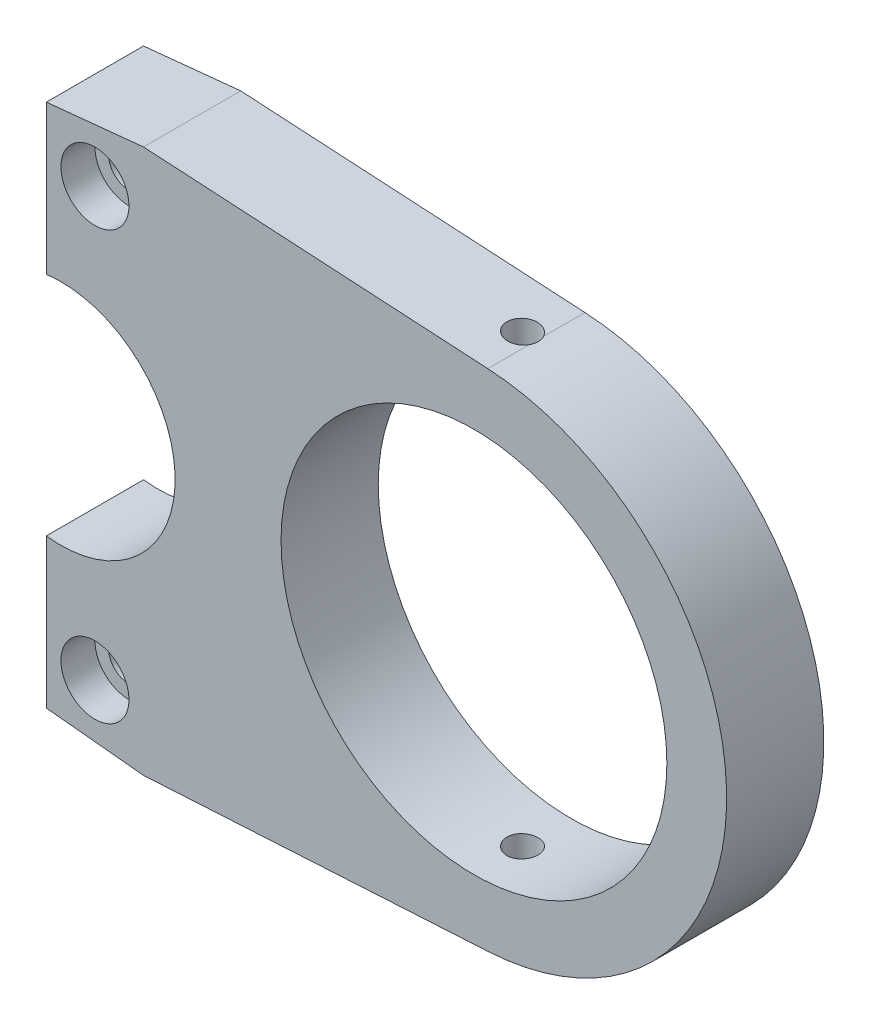
ISO-10303-21;
HEADER;
FILE_DESCRIPTION(('STEP AP214'),'2;1');
FILE_NAME('part.step','',(''),(''),'','','');
FILE_SCHEMA(('AUTOMOTIVE_DESIGN { 1 0 10303 214 1 1 1 1 }'));
ENDSEC;
DATA;
#1=APPLICATION_CONTEXT('core data for automotive mechanical design processes');
#2=APPLICATION_PROTOCOL_DEFINITION('international standard','automotive_design',2000,#1);
#3=PRODUCT_CONTEXT('',#1,'mechanical');
#4=PRODUCT('Part','Part','',(#3));
#5=PRODUCT_RELATED_PRODUCT_CATEGORY('part','',(#4));
#6=PRODUCT_DEFINITION_FORMATION('','',#4);
#7=PRODUCT_DEFINITION_CONTEXT('part definition',#1,'design');
#8=PRODUCT_DEFINITION('design','',#6,#7);
#9=PRODUCT_DEFINITION_SHAPE('','',#8);
#10=(LENGTH_UNIT() NAMED_UNIT(*) SI_UNIT(.MILLI.,.METRE.));
#11=(NAMED_UNIT(*) PLANE_ANGLE_UNIT() SI_UNIT($,.RADIAN.));
#12=(NAMED_UNIT(*) SI_UNIT($,.STERADIAN.) SOLID_ANGLE_UNIT());
#13=UNCERTAINTY_MEASURE_WITH_UNIT(LENGTH_MEASURE(1.E-05),#10,'distance_accuracy_value','');
#14=(GEOMETRIC_REPRESENTATION_CONTEXT(3) GLOBAL_UNCERTAINTY_ASSIGNED_CONTEXT((#13)) GLOBAL_UNIT_ASSIGNED_CONTEXT((#10,
#11,#12)) REPRESENTATION_CONTEXT('',''));
#15=CARTESIAN_POINT('',(0.,0.,0.));
#16=DIRECTION('',(0.,0.,1.));
#17=DIRECTION('',(1.,0.,0.));
#18=AXIS2_PLACEMENT_3D('',#15,#16,#17);
#19=CARTESIAN_POINT('',(-39.,-22.,-5.93969696196699));
#20=DIRECTION('',(0.,0.,1.));
#21=DIRECTION('',(1.,0.,0.));
#22=AXIS2_PLACEMENT_3D('',#19,#20,#21);
#23=CYLINDRICAL_SURFACE('',#22,2.1);
#24=CARTESIAN_POINT('',(-39.,-22.,0.));
#25=DIRECTION('',(0.,0.,1.));
#26=DIRECTION('',(1.,0.,0.));
#27=AXIS2_PLACEMENT_3D('',#24,#25,#26);
#28=CIRCLE('',#27,2.1);
#29=CARTESIAN_POINT('',(-36.9,-22.,0.));
#30=VERTEX_POINT('',#29);
#31=EDGE_CURVE('E210',#30,#30,#28,.F.);
#32=ORIENTED_EDGE('',*,*,#31,.T.);
#33=EDGE_LOOP('',(#32));
#34=FACE_BOUND('',#33,.T.);
#35=CARTESIAN_POINT('',(-39.,-22.,6.5));
#36=DIRECTION('',(0.,0.,1.));
#37=DIRECTION('',(1.,0.,0.));
#38=AXIS2_PLACEMENT_3D('',#35,#36,#37);
#39=CIRCLE('',#38,2.1);
#40=CARTESIAN_POINT('',(-36.9,-22.,6.5));
#41=VERTEX_POINT('',#40);
#42=EDGE_CURVE('E46',#41,#41,#39,.F.);
#43=ORIENTED_EDGE('',*,*,#42,.F.);
#44=EDGE_LOOP('',(#43));
#45=FACE_BOUND('',#44,.T.);
#46=ADVANCED_FACE('F41',(#34,#45),#23,.F.);
#47=CARTESIAN_POINT('',(-39.,22.,-5.93969696196699));
#48=DIRECTION('',(0.,0.,1.));
#49=DIRECTION('',(1.,0.,0.));
#50=AXIS2_PLACEMENT_3D('',#47,#48,#49);
#51=CYLINDRICAL_SURFACE('',#50,2.1);
#52=CARTESIAN_POINT('',(-39.,22.,0.));
#53=DIRECTION('',(0.,0.,1.));
#54=DIRECTION('',(1.,0.,0.));
#55=AXIS2_PLACEMENT_3D('',#52,#53,#54);
#56=CIRCLE('',#55,2.1);
#57=CARTESIAN_POINT('',(-36.9,22.,0.));
#58=VERTEX_POINT('',#57);
#59=EDGE_CURVE('E152',#58,#58,#56,.F.);
#60=ORIENTED_EDGE('',*,*,#59,.T.);
#61=EDGE_LOOP('',(#60));
#62=FACE_BOUND('',#61,.T.);
#63=CARTESIAN_POINT('',(-39.,22.,6.5));
#64=DIRECTION('',(0.,0.,1.));
#65=DIRECTION('',(1.,0.,0.));
#66=AXIS2_PLACEMENT_3D('',#63,#64,#65);
#67=CIRCLE('',#66,2.1);
#68=CARTESIAN_POINT('',(-36.9,22.,6.5));
#69=VERTEX_POINT('',#68);
#70=EDGE_CURVE('E214',#69,#69,#67,.F.);
#71=ORIENTED_EDGE('',*,*,#70,.F.);
#72=EDGE_LOOP('',(#71));
#73=FACE_BOUND('',#72,.T.);
#74=ADVANCED_FACE('F195',(#62,#73),#51,.F.);
#75=CARTESIAN_POINT('',(-44.,0.,10.));
#76=DIRECTION('',(1.,0.,0.));
#77=DIRECTION('',(0.,0.,-1.));
#78=AXIS2_PLACEMENT_3D('',#75,#76,#77);
#79=PLANE('',#78);
#80=DIRECTION('',(0.,-1.,0.));
#81=VECTOR('',#80,1.);
#82=CARTESIAN_POINT('',(-44.,0.,0.));
#83=LINE('',#82,#81);
#84=CARTESIAN_POINT('',(-44.,27.,0.));
#85=VERTEX_POINT('',#84);
#86=CARTESIAN_POINT('',(-44.,11.6538620208067,0.));
#87=VERTEX_POINT('',#86);
#88=EDGE_CURVE('E259',#85,#87,#83,.T.);
#89=ORIENTED_EDGE('',*,*,#88,.T.);
#90=DIRECTION('',(0.,0.,1.));
#91=VECTOR('',#90,1.);
#92=CARTESIAN_POINT('',(-44.,11.6538620208067,0.));
#93=LINE('',#92,#91);
#94=CARTESIAN_POINT('',(-44.,11.6538620208067,10.));
#95=VERTEX_POINT('',#94);
#96=EDGE_CURVE('E291',#87,#95,#93,.T.);
#97=ORIENTED_EDGE('',*,*,#96,.T.);
#98=DIRECTION('',(0.,-1.,0.));
#99=VECTOR('',#98,1.);
#100=CARTESIAN_POINT('',(-44.,0.,10.));
#101=LINE('',#100,#99);
#102=CARTESIAN_POINT('',(-44.,27.,10.));
#103=VERTEX_POINT('',#102);
#104=EDGE_CURVE('E294',#103,#95,#101,.T.);
#105=ORIENTED_EDGE('',*,*,#104,.F.);
#106=DIRECTION('',(0.,0.,-1.));
#107=VECTOR('',#106,1.);
#108=CARTESIAN_POINT('',(-44.,27.,10.));
#109=LINE('',#108,#107);
#110=EDGE_CURVE('E272',#103,#85,#109,.T.);
#111=ORIENTED_EDGE('',*,*,#110,.T.);
#112=EDGE_LOOP('',(#89,#97,#105,#111));
#113=FACE_BOUND('',#112,.T.);
#114=ADVANCED_FACE('F188',(#113),#79,.F.);
#115=CARTESIAN_POINT('',(1.49403203258918,-25.9570388967154,10.));
#116=DIRECTION('',(-0.0574627704841992,0.99834764987367,0.));
#117=DIRECTION('',(-0.99834764987367,-0.0574627704841992,0.));
#118=AXIS2_PLACEMENT_3D('',#115,#116,#117);
#119=PLANE('',#118);
#120=DIRECTION('',(0.,0.,-1.));
#121=VECTOR('',#120,1.);
#122=CARTESIAN_POINT('',(1.41858313203397,-25.9613815751966,10.));
#123=LINE('',#122,#121);
#124=CARTESIAN_POINT('',(1.41858313203397,-25.9613815751966,4.25998520453393));
#125=VERTEX_POINT('',#124);
#126=CARTESIAN_POINT('',(1.41858313203397,-25.9613815751966,0.));
#127=VERTEX_POINT('',#126);
#128=EDGE_CURVE('E138',#125,#127,#123,.T.);
#129=ORIENTED_EDGE('',*,*,#128,.F.);
#130=CARTESIAN_POINT('',(0.,-26.0430322075582,5.));
#131=DIRECTION('',(-0.0574627704841992,0.99834764987367,0.));
#132=DIRECTION('',(0.99834764987367,0.0574627704841992,0.));
#133=AXIS2_PLACEMENT_3D('',#130,#131,#132);
#134=ELLIPSE('',#133,1.60264813584973,1.6);
#135=CARTESIAN_POINT('',(1.41858313203397,-25.9613815751966,5.74001479546607));
#136=VERTEX_POINT('',#135);
#137=EDGE_CURVE('E58',#125,#136,#134,.T.);
#138=ORIENTED_EDGE('',*,*,#137,.T.);
#139=CARTESIAN_POINT('',(1.41858313203397,-25.9613815751966,10.));
#140=VERTEX_POINT('',#139);
#141=EDGE_CURVE('E51',#140,#136,#123,.T.);
#142=ORIENTED_EDGE('',*,*,#141,.F.);
#143=DIRECTION('',(0.99834764987367,0.0574627704841992,0.));
#144=VECTOR('',#143,1.);
#145=CARTESIAN_POINT('',(1.49403203258918,-25.9570388967154,10.));
#146=LINE('',#145,#144);
#147=CARTESIAN_POINT('',(-34.,-28.,10.));
#148=VERTEX_POINT('',#147);
#149=EDGE_CURVE('E302',#148,#140,#146,.T.);
#150=ORIENTED_EDGE('',*,*,#149,.F.);
#151=DIRECTION('',(0.,0.,-1.));
#152=VECTOR('',#151,1.);
#153=CARTESIAN_POINT('',(-34.,-28.,10.));
#154=LINE('',#153,#152);
#155=CARTESIAN_POINT('',(-34.,-28.,0.));
#156=VERTEX_POINT('',#155);
#157=EDGE_CURVE('E268',#148,#156,#154,.T.);
#158=ORIENTED_EDGE('',*,*,#157,.T.);
#159=DIRECTION('',(0.99834764987367,0.0574627704841992,0.));
#160=VECTOR('',#159,1.);
#161=CARTESIAN_POINT('',(1.49403203258918,-25.9570388967154,0.));
#162=LINE('',#161,#160);
#163=EDGE_CURVE('E285',#156,#127,#162,.T.);
#164=ORIENTED_EDGE('',*,*,#163,.T.);
#165=EDGE_LOOP('',(#129,#138,#142,#150,#158,#164));
#166=FACE_BOUND('',#165,.T.);
#167=ADVANCED_FACE('F184',(#166),#119,.F.);
#168=CARTESIAN_POINT('',(0.,0.,10.));
#169=DIRECTION('',(0.,0.,-1.));
#170=DIRECTION('',(-1.,0.,0.));
#171=AXIS2_PLACEMENT_3D('',#168,#169,#170);
#172=CYLINDRICAL_SURFACE('',#171,26.0001098342959);
#173=ORIENTED_EDGE('',*,*,#141,.T.);
#174=CARTESIAN_POINT('',(1.41858313203397,-25.9613815751966,5.74001479546607));
#175=CARTESIAN_POINT('',(1.43937507658781,-25.9602450679824,5.70015654036413));
#176=CARTESIAN_POINT('',(1.45847759914519,-25.9591766731977,5.65943932008011));
#177=CARTESIAN_POINT('',(1.49319191275783,-25.9572031377833,5.57654089511698));
#178=CARTESIAN_POINT('',(1.50880381687755,-25.956297991866,5.53435973790735));
#179=CARTESIAN_POINT('',(1.55018081630585,-25.9538711965253,5.40617333574399));
#180=CARTESIAN_POINT('',(1.57057362983555,-25.9526332929721,5.31835907905589));
#181=CARTESIAN_POINT('',(1.59635353442299,-25.9510603898566,5.14052256276176));
#182=CARTESIAN_POINT('',(1.60172838582971,-25.9507261267691,5.05049856245032));
#183=CARTESIAN_POINT('',(1.5973044603299,-25.9509986464391,4.87083216410767));
#184=CARTESIAN_POINT('',(1.58751106718245,-25.9516050953039,4.78118964199904));
#185=CARTESIAN_POINT('',(1.55555287534589,-25.9535391365629,4.61771111199342));
#186=CARTESIAN_POINT('',(1.53539623741904,-25.9547489171544,4.54347354642812));
#187=CARTESIAN_POINT('',(1.48467877854551,-25.9576965312559,4.39862905054255));
#188=CARTESIAN_POINT('',(1.45411485722505,-25.9594345221055,4.32802320935141));
#189=CARTESIAN_POINT('',(1.41858313203397,-25.9613815751966,4.25998520453393));
#190=B_SPLINE_CURVE_WITH_KNOTS('',3,(#174,#175,#176,#177,#178,#179,#180,#181,#182,#183,#184,
#185,#186,#187,#188,#189),.UNSPECIFIED.,.F.,.F.,(4,2,2,2,2,2,2,4),(0.,0.134826391317152,
0.269648414845423,0.53873773415111,0.808046297585967,1.07725929556573,1.30728778307609,
1.53738485708607),.UNSPECIFIED.);
#191=EDGE_CURVE('E133',#136,#125,#190,.T.);
#192=ORIENTED_EDGE('',*,*,#191,.T.);
#193=ORIENTED_EDGE('',*,*,#128,.T.);
#194=CARTESIAN_POINT('',(0.,0.,0.));
#195=DIRECTION('',(0.,0.,1.));
#196=DIRECTION('',(1.,0.,0.));
#197=AXIS2_PLACEMENT_3D('',#194,#195,#196);
#198=CIRCLE('',#197,26.0001098342959);
#199=CARTESIAN_POINT('',(1.41858313203397,25.9613815751966,0.));
#200=VERTEX_POINT('',#199);
#201=EDGE_CURVE('E284',#127,#200,#198,.T.);
#202=ORIENTED_EDGE('',*,*,#201,.T.);
#203=DIRECTION('',(0.,0.,-1.));
#204=VECTOR('',#203,1.);
#205=CARTESIAN_POINT('',(1.41858313203397,25.9613815751966,10.));
#206=LINE('',#205,#204);
#207=CARTESIAN_POINT('',(1.41858313203397,25.9613815751966,4.25998520453394));
#208=VERTEX_POINT('',#207);
#209=EDGE_CURVE('E132',#208,#200,#206,.T.);
#210=ORIENTED_EDGE('',*,*,#209,.F.);
#211=CARTESIAN_POINT('',(1.41858313203397,25.9613815751966,4.25998520453393));
#212=CARTESIAN_POINT('',(1.43937507658781,25.9602450679824,4.29984345963586));
#213=CARTESIAN_POINT('',(1.45847759914519,25.9591766731977,4.34056067991989));
#214=CARTESIAN_POINT('',(1.49319191275783,25.9572031377833,4.42345910488302));
#215=CARTESIAN_POINT('',(1.50880381687755,25.956297991866,4.46564026209265));
#216=CARTESIAN_POINT('',(1.55018081630585,25.9538711965253,4.59382666425601));
#217=CARTESIAN_POINT('',(1.57057362983555,25.9526332929721,4.68164092094411));
#218=CARTESIAN_POINT('',(1.59635353442299,25.9510603898566,4.85947743723824));
#219=CARTESIAN_POINT('',(1.60172838582971,25.9507261267691,4.94950143754968));
#220=CARTESIAN_POINT('',(1.5973044603299,25.9509986464391,5.12916783589232));
#221=CARTESIAN_POINT('',(1.58751106718245,25.9516050953039,5.21881035800096));
#222=CARTESIAN_POINT('',(1.55555287534589,25.9535391365629,5.38228888800658));
#223=CARTESIAN_POINT('',(1.53539623741904,25.9547489171544,5.45652645357188));
#224=CARTESIAN_POINT('',(1.48467877854551,25.9576965312559,5.60137094945745));
#225=CARTESIAN_POINT('',(1.45411485722505,25.9594345221055,5.67197679064859));
#226=CARTESIAN_POINT('',(1.41858313203397,25.9613815751966,5.74001479546607));
#227=B_SPLINE_CURVE_WITH_KNOTS('',3,(#211,#212,#213,#214,#215,#216,#217,#218,#219,#220,#221,
#222,#223,#224,#225,#226),.UNSPECIFIED.,.F.,.F.,(4,2,2,2,2,2,2,4),(0.,0.134826391317151,
0.269648414845421,0.53873773415111,0.808046297585966,1.07725929556573,1.30728778307609,
1.53738485708608),.UNSPECIFIED.);
#228=CARTESIAN_POINT('',(1.41858313203397,25.9613815751966,5.74001479546607));
#229=VERTEX_POINT('',#228);
#230=EDGE_CURVE('E65',#208,#229,#227,.T.);
#231=ORIENTED_EDGE('',*,*,#230,.T.);
#232=CARTESIAN_POINT('',(1.41858313203397,25.9613815751966,10.));
#233=VERTEX_POINT('',#232);
#234=EDGE_CURVE('E129',#233,#229,#206,.T.);
#235=ORIENTED_EDGE('',*,*,#234,.F.);
#236=CARTESIAN_POINT('',(0.,0.,10.));
#237=DIRECTION('',(0.,0.,1.));
#238=DIRECTION('',(1.,0.,0.));
#239=AXIS2_PLACEMENT_3D('',#236,#237,#238);
#240=CIRCLE('',#239,26.0001098342959);
#241=EDGE_CURVE('E300',#140,#233,#240,.T.);
#242=ORIENTED_EDGE('',*,*,#241,.F.);
#243=EDGE_LOOP('',(#173,#192,#193,#202,#210,#231,#235,#242));
#244=FACE_BOUND('',#243,.T.);
#245=ADVANCED_FACE('F128',(#244),#172,.T.);
#246=CARTESIAN_POINT('',(1.49403203258917,25.9570388967154,10.));
#247=DIRECTION('',(0.0574627704841989,0.99834764987367,0.));
#248=DIRECTION('',(-0.99834764987367,0.057462770484199,0.));
#249=AXIS2_PLACEMENT_3D('',#246,#247,#248);
#250=PLANE('',#249);
#251=CARTESIAN_POINT('',(0.,26.0430322075582,5.));
#252=DIRECTION('',(0.0574627704841989,0.99834764987367,0.));
#253=DIRECTION('',(-0.99834764987367,0.057462770484199,0.));
#254=AXIS2_PLACEMENT_3D('',#251,#252,#253);
#255=ELLIPSE('',#254,1.60264813584973,1.6);
#256=EDGE_CURVE('E118',#208,#229,#255,.T.);
#257=ORIENTED_EDGE('',*,*,#256,.F.);
#258=ORIENTED_EDGE('',*,*,#209,.T.);
#259=DIRECTION('',(0.99834764987367,-0.057462770484199,0.));
#260=VECTOR('',#259,1.);
#261=CARTESIAN_POINT('',(1.49403203258917,25.9570388967154,0.));
#262=LINE('',#261,#260);
#263=CARTESIAN_POINT('',(-34.,28.,0.));
#264=VERTEX_POINT('',#263);
#265=EDGE_CURVE('E262',#264,#200,#262,.T.);
#266=ORIENTED_EDGE('',*,*,#265,.F.);
#267=DIRECTION('',(0.,0.,-1.));
#268=VECTOR('',#267,1.);
#269=CARTESIAN_POINT('',(-34.,28.,10.));
#270=LINE('',#269,#268);
#271=CARTESIAN_POINT('',(-34.,28.,10.));
#272=VERTEX_POINT('',#271);
#273=EDGE_CURVE('E141',#272,#264,#270,.T.);
#274=ORIENTED_EDGE('',*,*,#273,.F.);
#275=DIRECTION('',(0.99834764987367,-0.057462770484199,0.));
#276=VECTOR('',#275,1.);
#277=CARTESIAN_POINT('',(1.49403203258917,25.9570388967154,10.));
#278=LINE('',#277,#276);
#279=EDGE_CURVE('E137',#272,#233,#278,.T.);
#280=ORIENTED_EDGE('',*,*,#279,.T.);
#281=ORIENTED_EDGE('',*,*,#234,.T.);
#282=EDGE_LOOP('',(#257,#258,#266,#274,#280,#281));
#283=FACE_BOUND('',#282,.T.);
#284=ADVANCED_FACE('F135',(#283),#250,.T.);
#285=CARTESIAN_POINT('',(-3.10891089108913,31.0891089108911,10.));
#286=DIRECTION('',(0.0995037190209994,-0.995037190209989,0.));
#287=DIRECTION('',(0.995037190209989,0.0995037190209994,0.));
#288=AXIS2_PLACEMENT_3D('',#285,#286,#287);
#289=PLANE('',#288);
#290=DIRECTION('',(-0.995037190209989,-0.0995037190209994,0.));
#291=VECTOR('',#290,1.);
#292=CARTESIAN_POINT('',(-3.10891089108913,31.0891089108911,0.));
#293=LINE('',#292,#291);
#294=EDGE_CURVE('E260',#264,#85,#293,.T.);
#295=ORIENTED_EDGE('',*,*,#294,.T.);
#296=ORIENTED_EDGE('',*,*,#110,.F.);
#297=DIRECTION('',(-0.995037190209989,-0.0995037190209994,0.));
#298=VECTOR('',#297,1.);
#299=CARTESIAN_POINT('',(-3.10891089108913,31.0891089108911,10.));
#300=LINE('',#299,#298);
#301=EDGE_CURVE('E280',#272,#103,#300,.T.);
#302=ORIENTED_EDGE('',*,*,#301,.F.);
#303=ORIENTED_EDGE('',*,*,#273,.T.);
#304=EDGE_LOOP('',(#295,#296,#302,#303));
#305=FACE_BOUND('',#304,.T.);
#306=ADVANCED_FACE('F279',(#305),#289,.F.);
#307=CARTESIAN_POINT('',(-44.,-11.6538620208067,10.));
#308=VERTEX_POINT('',#307);
#309=CARTESIAN_POINT('',(-44.,-27.,10.));
#310=VERTEX_POINT('',#309);
#311=EDGE_CURVE('E297',#308,#310,#101,.T.);
#312=ORIENTED_EDGE('',*,*,#311,.F.);
#313=DIRECTION('',(0.,0.,1.));
#314=VECTOR('',#313,1.);
#315=CARTESIAN_POINT('',(-44.,-11.6538620208067,0.));
#316=LINE('',#315,#314);
#317=CARTESIAN_POINT('',(-44.,-11.6538620208067,0.));
#318=VERTEX_POINT('',#317);
#319=EDGE_CURVE('E309',#308,#318,#316,.F.);
#320=ORIENTED_EDGE('',*,*,#319,.T.);
#321=CARTESIAN_POINT('',(-44.,-27.,0.));
#322=VERTEX_POINT('',#321);
#323=EDGE_CURVE('E249',#318,#322,#83,.T.);
#324=ORIENTED_EDGE('',*,*,#323,.T.);
#325=DIRECTION('',(0.,0.,-1.));
#326=VECTOR('',#325,1.);
#327=CARTESIAN_POINT('',(-44.,-27.,10.));
#328=LINE('',#327,#326);
#329=EDGE_CURVE('E270',#310,#322,#328,.T.);
#330=ORIENTED_EDGE('',*,*,#329,.F.);
#331=EDGE_LOOP('',(#312,#320,#324,#330));
#332=FACE_BOUND('',#331,.T.);
#333=ADVANCED_FACE('F198',(#332),#79,.F.);
#334=CARTESIAN_POINT('',(0.,0.,10.));
#335=DIRECTION('',(0.,0.,-1.));
#336=DIRECTION('',(-1.,0.,0.));
#337=AXIS2_PLACEMENT_3D('',#334,#335,#336);
#338=CYLINDRICAL_SURFACE('',#337,19.85);
#339=CARTESIAN_POINT('',(0.,-19.85,6.6));
#340=CARTESIAN_POINT('',(0.0897164720844544,-19.8499991533099,6.59999607687656));
#341=CARTESIAN_POINT('',(0.179494276328936,-19.8493852726301,6.59242864128234));
#342=CARTESIAN_POINT('',(0.356566650928613,-19.8469954028663,6.56235165407598));
#343=CARTESIAN_POINT('',(0.443858278698605,-19.8452180919258,6.53982510592116));
#344=CARTESIAN_POINT('',(0.613368063091008,-19.8407022383765,6.48048488950226));
#345=CARTESIAN_POINT('',(0.695589032021481,-19.837964234332,6.44367922488694));
#346=CARTESIAN_POINT('',(0.852666068369608,-19.831834178824,6.35683968128687));
#347=CARTESIAN_POINT('',(0.927523722710772,-19.8284422687572,6.30680866120681));
#348=CARTESIAN_POINT('',(1.06794836542464,-19.8213760310116,6.19480905133566));
#349=CARTESIAN_POINT('',(1.13349530401926,-19.8177011193743,6.13281535785651));
#350=CARTESIAN_POINT('',(1.25326591238565,-19.8104879750798,5.99870309054985));
#351=CARTESIAN_POINT('',(1.30748908840516,-19.806949748388,5.92658407545512));
#352=CARTESIAN_POINT('',(1.40314019789172,-19.8004042266068,5.77414779243943));
#353=CARTESIAN_POINT('',(1.44455061357576,-19.7973976607953,5.69381949841733));
#354=CARTESIAN_POINT('',(1.5132887944648,-19.7922624292564,5.52732178589536));
#355=CARTESIAN_POINT('',(1.54061679400813,-19.7901337489205,5.44115246462008));
#356=CARTESIAN_POINT('',(1.5803565106764,-19.7870001242495,5.26561883533031));
#357=CARTESIAN_POINT('',(1.5928007651627,-19.7859927290084,5.17626193804098));
#358=CARTESIAN_POINT('',(1.60252025217774,-19.7852079554635,4.99672244319442));
#359=CARTESIAN_POINT('',(1.59979575273781,-19.7854305554256,4.90653986025515));
#360=CARTESIAN_POINT('',(1.57928197517034,-19.7870783972882,4.72813173524038));
#361=CARTESIAN_POINT('',(1.56152803568777,-19.7885008180282,4.63990210015031));
#362=CARTESIAN_POINT('',(1.5115142365346,-19.7923835986298,4.46767916789796));
#363=CARTESIAN_POINT('',(1.47925424320185,-19.7948439680553,4.38368590977858));
#364=CARTESIAN_POINT('',(1.40110443090409,-19.8005286642688,4.22220723644014));
#365=CARTESIAN_POINT('',(1.35519873120386,-19.8037538802883,4.14472953949401));
#366=CARTESIAN_POINT('',(1.25107205635912,-19.8106040292994,3.99856569616994));
#367=CARTESIAN_POINT('',(1.19285084810592,-19.8142289698565,3.92987971624166));
#368=CARTESIAN_POINT('',(1.06554751616025,-19.8214826650549,3.80304355526665));
#369=CARTESIAN_POINT('',(0.996434837019086,-19.825111401003,3.74492403672362));
#370=CARTESIAN_POINT('',(0.849417093625886,-19.8319539298293,3.64110759121553));
#371=CARTESIAN_POINT('',(0.77151202398419,-19.835167722453,3.59541067186548));
#372=CARTESIAN_POINT('',(0.60910120321957,-19.8408188073793,3.51773860166719));
#373=CARTESIAN_POINT('',(0.524594813687729,-19.8432560244638,3.48576477991659));
#374=CARTESIAN_POINT('',(0.351389202336982,-19.8470784665035,3.43646784685923));
#375=CARTESIAN_POINT('',(0.262690061960984,-19.8484637118842,3.41914445109578));
#376=CARTESIAN_POINT('',(0.0838826069870477,-19.8500235068708,3.39967849503293));
#377=CARTESIAN_POINT('',(-0.00622106799322056,-19.8502014346359,3.39749357585531));
#378=CARTESIAN_POINT('',(-0.18551346417963,-19.8493355635358,3.40825567174994));
#379=CARTESIAN_POINT('',(-0.274702193355811,-19.8482917753221,3.42120255489684));
#380=CARTESIAN_POINT('',(-0.449512391906601,-19.8451020482803,3.46182563771419));
#381=CARTESIAN_POINT('',(-0.535138446105389,-19.8429575765401,3.48948223276217));
#382=CARTESIAN_POINT('',(-0.700534631543955,-19.8378074368406,3.55871966350822));
#383=CARTESIAN_POINT('',(-0.780304675965854,-19.8348017561167,3.60030070559143));
#384=CARTESIAN_POINT('',(-0.931917409413897,-19.8282578282863,3.69631334909164));
#385=CARTESIAN_POINT('',(-1.00374225536118,-19.8247184230265,3.75077304620904));
#386=CARTESIAN_POINT('',(-1.13724570590316,-19.8175086909349,3.87095645829867));
#387=CARTESIAN_POINT('',(-1.19892414552982,-19.8138383619756,3.93668035637741));
#388=CARTESIAN_POINT('',(-1.31052899211335,-19.8067704800209,4.07771016734143));
#389=CARTESIAN_POINT('',(-1.36042778089921,-19.803373580138,4.15303797329942));
#390=CARTESIAN_POINT('',(-1.446867582443,-19.7972462729922,4.31102819252621));
#391=CARTESIAN_POINT('',(-1.48340872118075,-19.7945158594435,4.39369053661175));
#392=CARTESIAN_POINT('',(-1.54204879267438,-19.7900342430716,4.56390510642077));
#393=CARTESIAN_POINT('',(-1.56416470185943,-19.7882818895636,4.65145145211864));
#394=CARTESIAN_POINT('',(-1.59338182264284,-19.7859508883395,4.82902959190818));
#395=CARTESIAN_POINT('',(-1.6004833019325,-19.785372219698,4.91906134165876));
#396=CARTESIAN_POINT('',(-1.59946697055161,-19.7854543859718,5.09878013960421));
#397=CARTESIAN_POINT('',(-1.59139255691417,-19.7861116865082,5.18846743802809));
#398=CARTESIAN_POINT('',(-1.56034405874358,-19.7885842228376,5.36520783279648));
#399=CARTESIAN_POINT('',(-1.53736995075151,-19.7903994604538,5.45226092499334));
#400=CARTESIAN_POINT('',(-1.47718504740187,-19.7949824142197,5.62126511712381));
#401=CARTESIAN_POINT('',(-1.43997495506048,-19.7977500833348,5.70321646876456));
#402=CARTESIAN_POINT('',(-1.35237930834905,-19.8039261145337,5.85971592504421));
#403=CARTESIAN_POINT('',(-1.3019939804421,-19.8073344656048,5.93426415690156));
#404=CARTESIAN_POINT('',(-1.18931520596895,-19.8144193889705,6.07406315682728));
#405=CARTESIAN_POINT('',(-1.12698969137814,-19.8180966666988,6.13928804195892));
#406=CARTESIAN_POINT('',(-0.992256583907138,-19.8252986876362,6.25837649349705));
#407=CARTESIAN_POINT('',(-0.919846551307538,-19.8288233936627,6.3122373026703));
#408=CARTESIAN_POINT('',(-0.766868881949594,-19.8353290749212,6.40713598616266));
#409=CARTESIAN_POINT('',(-0.686287051600197,-19.8383090780105,6.44815102564015));
#410=CARTESIAN_POINT('',(-0.519412016146152,-19.8433780059107,6.51601661282863));
#411=CARTESIAN_POINT('',(-0.433125524366333,-19.8454679573192,6.54288348773376));
#412=CARTESIAN_POINT('',(-0.28860596671724,-19.8479831303702,6.57482689729441));
#413=CARTESIAN_POINT('',(-0.231303067030027,-19.8487360254636,6.58425431422709));
#414=CARTESIAN_POINT('',(-0.116008659830827,-19.8497447334335,6.59684212637088));
#415=CARTESIAN_POINT('',(-0.0580171540105575,-19.850000547531,6.60000253697511));
#416=CARTESIAN_POINT('',(0.,-19.85,6.6));
#417=B_SPLINE_CURVE_WITH_KNOTS('',3,(#339,#340,#341,#342,#343,#344,#345,#346,#347,#348,#349,
#350,#351,#352,#353,#354,#355,#356,#357,#358,#359,#360,#361,#362,#363,#364,#365,#366,#367,#368,
#369,#370,#371,#372,#373,#374,#375,#376,#377,#378,#379,#380,#381,#382,#383,#384,#385,#386,#387,
#388,#389,#390,#391,#392,#393,#394,#395,#396,#397,#398,#399,#400,#401,#402,#403,#404,#405,#406,
#407,#408,#409,#410,#411,#412,#413,#414,#415,#416),.UNSPECIFIED.,.T.,.F.,(4,2,2,2,2,2,2,2,2,2,2,
2,2,2,2,2,2,2,2,2,2,2,2,2,2,2,2,2,2,2,2,2,2,2,2,2,2,2,4),(0.,0.268937594547132,
0.538181279986524,0.807274268025582,1.07630913414959,1.34591483372728,1.61553228652254,
1.88551675156457,2.15549672378703,2.42488540756222,2.69426933126439,2.96302160760912,
3.23177636035043,3.50084511993777,3.76991897293043,4.03976159652442,4.30960438553062,
4.5794733032244,4.84933698094919,5.11844524872791,5.38755117032638,5.65629933179507,
5.92505147676732,6.1943954221751,6.46374374634983,6.73371743917182,7.00368858572888,
7.27334143889939,7.54298948440606,7.81186761644375,8.08074617181922,8.34961145086766,
8.61847210881755,8.88806523974195,9.15772370624846,9.42785883636823,9.69768153952929,
9.87159644951193,10.0455109323215),.UNSPECIFIED.);
#418=CARTESIAN_POINT('',(0.,-19.85,6.6));
#419=VERTEX_POINT('',#418);
#420=EDGE_CURVE('E123',#419,#419,#417,.T.);
#421=ORIENTED_EDGE('',*,*,#420,.F.);
#422=EDGE_LOOP('',(#421));
#423=FACE_BOUND('',#422,.T.);
#424=CARTESIAN_POINT('',(0.,19.85,6.6));
#425=CARTESIAN_POINT('',(-0.0897164720844544,19.8499991533099,6.59999607687656));
#426=CARTESIAN_POINT('',(-0.179494276328936,19.8493852726301,6.59242864128234));
#427=CARTESIAN_POINT('',(-0.356566650928613,19.8469954028663,6.56235165407598));
#428=CARTESIAN_POINT('',(-0.443858278698605,19.8452180919258,6.53982510592116));
#429=CARTESIAN_POINT('',(-0.613368063091008,19.8407022383765,6.48048488950226));
#430=CARTESIAN_POINT('',(-0.695589032021481,19.837964234332,6.44367922488694));
#431=CARTESIAN_POINT('',(-0.852666068369608,19.831834178824,6.35683968128687));
#432=CARTESIAN_POINT('',(-0.927523722710772,19.8284422687572,6.30680866120681));
#433=CARTESIAN_POINT('',(-1.06794836542464,19.8213760310116,6.19480905133566));
#434=CARTESIAN_POINT('',(-1.13349530401926,19.8177011193743,6.13281535785651));
#435=CARTESIAN_POINT('',(-1.25326591238565,19.8104879750798,5.99870309054985));
#436=CARTESIAN_POINT('',(-1.30748908840516,19.806949748388,5.92658407545512));
#437=CARTESIAN_POINT('',(-1.40314019789172,19.8004042266068,5.77414779243943));
#438=CARTESIAN_POINT('',(-1.44455061357576,19.7973976607953,5.69381949841733));
#439=CARTESIAN_POINT('',(-1.5132887944648,19.7922624292564,5.52732178589536));
#440=CARTESIAN_POINT('',(-1.54061679400813,19.7901337489205,5.44115246462008));
#441=CARTESIAN_POINT('',(-1.5803565106764,19.7870001242495,5.26561883533031));
#442=CARTESIAN_POINT('',(-1.5928007651627,19.7859927290084,5.17626193804098));
#443=CARTESIAN_POINT('',(-1.60252025217774,19.7852079554635,4.99672244319442));
#444=CARTESIAN_POINT('',(-1.59979575273781,19.7854305554256,4.90653986025515));
#445=CARTESIAN_POINT('',(-1.57928197517034,19.7870783972882,4.72813173524038));
#446=CARTESIAN_POINT('',(-1.56152803568777,19.7885008180282,4.63990210015031));
#447=CARTESIAN_POINT('',(-1.5115142365346,19.7923835986298,4.46767916789796));
#448=CARTESIAN_POINT('',(-1.47925424320185,19.7948439680553,4.38368590977858));
#449=CARTESIAN_POINT('',(-1.40110443090409,19.8005286642688,4.22220723644014));
#450=CARTESIAN_POINT('',(-1.35519873120386,19.8037538802883,4.14472953949401));
#451=CARTESIAN_POINT('',(-1.25107205635912,19.8106040292994,3.99856569616994));
#452=CARTESIAN_POINT('',(-1.19285084810592,19.8142289698565,3.92987971624166));
#453=CARTESIAN_POINT('',(-1.06554751616025,19.8214826650549,3.80304355526665));
#454=CARTESIAN_POINT('',(-0.996434837019086,19.825111401003,3.74492403672362));
#455=CARTESIAN_POINT('',(-0.849417093625886,19.8319539298293,3.64110759121553));
#456=CARTESIAN_POINT('',(-0.77151202398419,19.835167722453,3.59541067186548));
#457=CARTESIAN_POINT('',(-0.60910120321957,19.8408188073793,3.51773860166719));
#458=CARTESIAN_POINT('',(-0.524594813687729,19.8432560244638,3.48576477991659));
#459=CARTESIAN_POINT('',(-0.351389202336982,19.8470784665035,3.43646784685923));
#460=CARTESIAN_POINT('',(-0.262690061960984,19.8484637118842,3.41914445109578));
#461=CARTESIAN_POINT('',(-0.0838826069870477,19.8500235068708,3.39967849503293));
#462=CARTESIAN_POINT('',(0.00622106799322056,19.8502014346359,3.39749357585531));
#463=CARTESIAN_POINT('',(0.18551346417963,19.8493355635358,3.40825567174994));
#464=CARTESIAN_POINT('',(0.274702193355811,19.8482917753221,3.42120255489684));
#465=CARTESIAN_POINT('',(0.449512391906601,19.8451020482803,3.46182563771419));
#466=CARTESIAN_POINT('',(0.535138446105389,19.8429575765401,3.48948223276217));
#467=CARTESIAN_POINT('',(0.700534631543955,19.8378074368406,3.55871966350822));
#468=CARTESIAN_POINT('',(0.780304675965854,19.8348017561167,3.60030070559143));
#469=CARTESIAN_POINT('',(0.931917409413897,19.8282578282863,3.69631334909164));
#470=CARTESIAN_POINT('',(1.00374225536118,19.8247184230265,3.75077304620904));
#471=CARTESIAN_POINT('',(1.13724570590316,19.8175086909349,3.87095645829867));
#472=CARTESIAN_POINT('',(1.19892414552982,19.8138383619756,3.93668035637741));
#473=CARTESIAN_POINT('',(1.31052899211335,19.8067704800209,4.07771016734143));
#474=CARTESIAN_POINT('',(1.36042778089921,19.803373580138,4.15303797329942));
#475=CARTESIAN_POINT('',(1.446867582443,19.7972462729922,4.31102819252621));
#476=CARTESIAN_POINT('',(1.48340872118075,19.7945158594435,4.39369053661175));
#477=CARTESIAN_POINT('',(1.54204879267438,19.7900342430716,4.56390510642077));
#478=CARTESIAN_POINT('',(1.56416470185943,19.7882818895636,4.65145145211864));
#479=CARTESIAN_POINT('',(1.59338182264284,19.7859508883395,4.82902959190818));
#480=CARTESIAN_POINT('',(1.6004833019325,19.785372219698,4.91906134165876));
#481=CARTESIAN_POINT('',(1.59946697055161,19.7854543859718,5.09878013960421));
#482=CARTESIAN_POINT('',(1.59139255691417,19.7861116865082,5.18846743802809));
#483=CARTESIAN_POINT('',(1.56034405874358,19.7885842228376,5.36520783279648));
#484=CARTESIAN_POINT('',(1.53736995075151,19.7903994604538,5.45226092499334));
#485=CARTESIAN_POINT('',(1.47718504740187,19.7949824142197,5.62126511712381));
#486=CARTESIAN_POINT('',(1.43997495506048,19.7977500833348,5.70321646876456));
#487=CARTESIAN_POINT('',(1.35237930834905,19.8039261145337,5.85971592504421));
#488=CARTESIAN_POINT('',(1.3019939804421,19.8073344656048,5.93426415690156));
#489=CARTESIAN_POINT('',(1.18931520596895,19.8144193889705,6.07406315682728));
#490=CARTESIAN_POINT('',(1.12698969137814,19.8180966666988,6.13928804195892));
#491=CARTESIAN_POINT('',(0.992256583907138,19.8252986876362,6.25837649349705));
#492=CARTESIAN_POINT('',(0.919846551307538,19.8288233936627,6.3122373026703));
#493=CARTESIAN_POINT('',(0.766868881949594,19.8353290749212,6.40713598616266));
#494=CARTESIAN_POINT('',(0.686287051600197,19.8383090780105,6.44815102564015));
#495=CARTESIAN_POINT('',(0.519412016146152,19.8433780059107,6.51601661282863));
#496=CARTESIAN_POINT('',(0.433125524366333,19.8454679573192,6.54288348773376));
#497=CARTESIAN_POINT('',(0.28860596671724,19.8479831303702,6.57482689729441));
#498=CARTESIAN_POINT('',(0.231303067030027,19.8487360254636,6.58425431422709));
#499=CARTESIAN_POINT('',(0.116008659830827,19.8497447334335,6.59684212637088));
#500=CARTESIAN_POINT('',(0.0580171540105575,19.850000547531,6.60000253697511));
#501=CARTESIAN_POINT('',(0.,19.85,6.6));
#502=B_SPLINE_CURVE_WITH_KNOTS('',3,(#424,#425,#426,#427,#428,#429,#430,#431,#432,#433,#434,
#435,#436,#437,#438,#439,#440,#441,#442,#443,#444,#445,#446,#447,#448,#449,#450,#451,#452,#453,
#454,#455,#456,#457,#458,#459,#460,#461,#462,#463,#464,#465,#466,#467,#468,#469,#470,#471,#472,
#473,#474,#475,#476,#477,#478,#479,#480,#481,#482,#483,#484,#485,#486,#487,#488,#489,#490,#491,
#492,#493,#494,#495,#496,#497,#498,#499,#500,#501),.UNSPECIFIED.,.T.,.F.,(4,2,2,2,2,2,2,2,2,2,2,
2,2,2,2,2,2,2,2,2,2,2,2,2,2,2,2,2,2,2,2,2,2,2,2,2,2,2,4),(0.,0.268937594547132,
0.538181279986524,0.807274268025582,1.07630913414959,1.34591483372728,1.61553228652254,
1.88551675156457,2.15549672378703,2.42488540756222,2.69426933126439,2.96302160760912,
3.23177636035043,3.50084511993777,3.76991897293043,4.03976159652442,4.30960438553062,
4.5794733032244,4.84933698094919,5.11844524872791,5.38755117032638,5.65629933179507,
5.92505147676732,6.1943954221751,6.46374374634983,6.73371743917182,7.00368858572888,
7.27334143889939,7.54298948440606,7.81186761644375,8.08074617181922,8.34961145086766,
8.61847210881755,8.88806523974195,9.15772370624846,9.42785883636823,9.69768153952929,
9.87159644951193,10.0455109323215),.UNSPECIFIED.);
#503=CARTESIAN_POINT('',(0.,19.85,6.6));
#504=VERTEX_POINT('',#503);
#505=EDGE_CURVE('E145',#504,#504,#502,.T.);
#506=ORIENTED_EDGE('',*,*,#505,.F.);
#507=EDGE_LOOP('',(#506));
#508=FACE_BOUND('',#507,.T.);
#509=CARTESIAN_POINT('',(0.,0.,10.));
#510=DIRECTION('',(0.,0.,1.));
#511=DIRECTION('',(1.,0.,0.));
#512=AXIS2_PLACEMENT_3D('',#509,#510,#511);
#513=CIRCLE('',#512,19.85);
#514=CARTESIAN_POINT('',(19.85,0.,10.));
#515=VERTEX_POINT('',#514);
#516=EDGE_CURVE('E267',#515,#515,#513,.T.);
#517=ORIENTED_EDGE('',*,*,#516,.T.);
#518=EDGE_LOOP('',(#517));
#519=FACE_BOUND('',#518,.T.);
#520=CARTESIAN_POINT('',(0.,0.,0.));
#521=DIRECTION('',(0.,0.,1.));
#522=DIRECTION('',(1.,0.,0.));
#523=AXIS2_PLACEMENT_3D('',#520,#521,#522);
#524=CIRCLE('',#523,19.85);
#525=CARTESIAN_POINT('',(19.85,0.,0.));
#526=VERTEX_POINT('',#525);
#527=EDGE_CURVE('E246',#526,#526,#524,.T.);
#528=ORIENTED_EDGE('',*,*,#527,.F.);
#529=EDGE_LOOP('',(#528));
#530=FACE_BOUND('',#529,.T.);
#531=ADVANCED_FACE('F43',(#423,#508,#519,#530),#338,.F.);
#532=CARTESIAN_POINT('',(-3.1089108910891,-31.0891089108911,10.));
#533=DIRECTION('',(-0.0995037190209987,-0.995037190209989,0.));
#534=DIRECTION('',(0.995037190209989,-0.0995037190209987,0.));
#535=AXIS2_PLACEMENT_3D('',#532,#533,#534);
#536=PLANE('',#535);
#537=DIRECTION('',(-0.995037190209989,0.0995037190209987,0.));
#538=VECTOR('',#537,1.);
#539=CARTESIAN_POINT('',(-3.1089108910891,-31.0891089108911,0.));
#540=LINE('',#539,#538);
#541=EDGE_CURVE('E254',#156,#322,#540,.T.);
#542=ORIENTED_EDGE('',*,*,#541,.F.);
#543=ORIENTED_EDGE('',*,*,#157,.F.);
#544=DIRECTION('',(-0.995037190209989,0.0995037190209987,0.));
#545=VECTOR('',#544,1.);
#546=CARTESIAN_POINT('',(-3.1089108910891,-31.0891089108911,10.));
#547=LINE('',#546,#545);
#548=EDGE_CURVE('E271',#148,#310,#547,.T.);
#549=ORIENTED_EDGE('',*,*,#548,.T.);
#550=ORIENTED_EDGE('',*,*,#329,.T.);
#551=EDGE_LOOP('',(#542,#543,#549,#550));
#552=FACE_BOUND('',#551,.T.);
#553=ADVANCED_FACE('F315',(#552),#536,.T.);
#554=CARTESIAN_POINT('',(0.,0.,10.));
#555=DIRECTION('',(0.,0.,1.));
#556=DIRECTION('',(1.,0.,0.));
#557=AXIS2_PLACEMENT_3D('',#554,#555,#556);
#558=PLANE('',#557);
#559=CARTESIAN_POINT('',(-39.,22.,10.));
#560=DIRECTION('',(0.,0.,1.));
#561=DIRECTION('',(1.,0.,0.));
#562=AXIS2_PLACEMENT_3D('',#559,#560,#561);
#563=CIRCLE('',#562,3.5);
#564=CARTESIAN_POINT('',(-35.5,22.,10.));
#565=VERTEX_POINT('',#564);
#566=EDGE_CURVE('E220',#565,#565,#563,.T.);
#567=ORIENTED_EDGE('',*,*,#566,.F.);
#568=EDGE_LOOP('',(#567));
#569=FACE_BOUND('',#568,.T.);
#570=CARTESIAN_POINT('',(-39.,-22.,10.));
#571=DIRECTION('',(0.,0.,1.));
#572=DIRECTION('',(1.,0.,0.));
#573=AXIS2_PLACEMENT_3D('',#570,#571,#572);
#574=CIRCLE('',#573,3.5);
#575=CARTESIAN_POINT('',(-35.5,-22.,10.));
#576=VERTEX_POINT('',#575);
#577=EDGE_CURVE('E230',#576,#576,#574,.T.);
#578=ORIENTED_EDGE('',*,*,#577,.F.);
#579=EDGE_LOOP('',(#578));
#580=FACE_BOUND('',#579,.T.);
#581=CARTESIAN_POINT('',(-42.5,0.,10.));
#582=DIRECTION('',(0.,0.,1.));
#583=DIRECTION('',(1.,0.,0.));
#584=AXIS2_PLACEMENT_3D('',#581,#582,#583);
#585=CIRCLE('',#584,11.75);
#586=EDGE_CURVE('E311',#308,#95,#585,.T.);
#587=ORIENTED_EDGE('',*,*,#586,.F.);
#588=ORIENTED_EDGE('',*,*,#311,.T.);
#589=ORIENTED_EDGE('',*,*,#548,.F.);
#590=ORIENTED_EDGE('',*,*,#149,.T.);
#591=ORIENTED_EDGE('',*,*,#241,.T.);
#592=ORIENTED_EDGE('',*,*,#279,.F.);
#593=ORIENTED_EDGE('',*,*,#301,.T.);
#594=ORIENTED_EDGE('',*,*,#104,.T.);
#595=EDGE_LOOP('',(#587,#588,#589,#590,#591,#592,#593,#594));
#596=FACE_BOUND('',#595,.T.);
#597=ORIENTED_EDGE('',*,*,#516,.F.);
#598=EDGE_LOOP('',(#597));
#599=FACE_BOUND('',#598,.T.);
#600=ADVANCED_FACE('F240',(#569,#580,#596,#599),#558,.T.);
#601=CARTESIAN_POINT('',(0.,0.,0.));
#602=DIRECTION('',(0.,0.,1.));
#603=DIRECTION('',(1.,0.,0.));
#604=AXIS2_PLACEMENT_3D('',#601,#602,#603);
#605=PLANE('',#604);
#606=ORIENTED_EDGE('',*,*,#59,.F.);
#607=EDGE_LOOP('',(#606));
#608=FACE_BOUND('',#607,.T.);
#609=ORIENTED_EDGE('',*,*,#31,.F.);
#610=EDGE_LOOP('',(#609));
#611=FACE_BOUND('',#610,.T.);
#612=ORIENTED_EDGE('',*,*,#527,.T.);
#613=EDGE_LOOP('',(#612));
#614=FACE_BOUND('',#613,.T.);
#615=ORIENTED_EDGE('',*,*,#323,.F.);
#616=CARTESIAN_POINT('',(-42.5,0.,0.));
#617=DIRECTION('',(0.,0.,1.));
#618=DIRECTION('',(1.,0.,0.));
#619=AXIS2_PLACEMENT_3D('',#616,#617,#618);
#620=CIRCLE('',#619,11.75);
#621=EDGE_CURVE('E11',#318,#87,#620,.T.);
#622=ORIENTED_EDGE('',*,*,#621,.T.);
#623=ORIENTED_EDGE('',*,*,#88,.F.);
#624=ORIENTED_EDGE('',*,*,#294,.F.);
#625=ORIENTED_EDGE('',*,*,#265,.T.);
#626=ORIENTED_EDGE('',*,*,#201,.F.);
#627=ORIENTED_EDGE('',*,*,#163,.F.);
#628=ORIENTED_EDGE('',*,*,#541,.T.);
#629=EDGE_LOOP('',(#615,#622,#623,#624,#625,#626,#627,#628));
#630=FACE_BOUND('',#629,.T.);
#631=ADVANCED_FACE('F237',(#608,#611,#614,#630),#605,.F.);
#632=CARTESIAN_POINT('',(-42.5,0.,0.));
#633=DIRECTION('',(0.,0.,1.));
#634=DIRECTION('',(1.,0.,0.));
#635=AXIS2_PLACEMENT_3D('',#632,#633,#634);
#636=CYLINDRICAL_SURFACE('',#635,11.75);
#637=ORIENTED_EDGE('',*,*,#621,.F.);
#638=ORIENTED_EDGE('',*,*,#319,.F.);
#639=ORIENTED_EDGE('',*,*,#586,.T.);
#640=ORIENTED_EDGE('',*,*,#96,.F.);
#641=EDGE_LOOP('',(#637,#638,#639,#640));
#642=FACE_BOUND('',#641,.T.);
#643=ADVANCED_FACE('F164',(#642),#636,.F.);
#644=CARTESIAN_POINT('',(0.,-27.,5.));
#645=DIRECTION('',(0.,1.,0.));
#646=DIRECTION('',(0.,0.,1.));
#647=AXIS2_PLACEMENT_3D('',#644,#645,#646);
#648=CYLINDRICAL_SURFACE('',#647,1.6);
#649=ORIENTED_EDGE('',*,*,#505,.T.);
#650=EDGE_LOOP('',(#649));
#651=FACE_BOUND('',#650,.T.);
#652=ORIENTED_EDGE('',*,*,#256,.T.);
#653=ORIENTED_EDGE('',*,*,#230,.F.);
#654=EDGE_LOOP('',(#652,#653));
#655=FACE_BOUND('',#654,.T.);
#656=ADVANCED_FACE('F119',(#651,#655),#648,.F.);
#657=ORIENTED_EDGE('',*,*,#420,.T.);
#658=EDGE_LOOP('',(#657));
#659=FACE_BOUND('',#658,.T.);
#660=ORIENTED_EDGE('',*,*,#191,.F.);
#661=ORIENTED_EDGE('',*,*,#137,.F.);
#662=EDGE_LOOP('',(#660,#661));
#663=FACE_BOUND('',#662,.T.);
#664=ADVANCED_FACE('F156',(#659,#663),#648,.F.);
#665=CARTESIAN_POINT('',(-39.,22.,6.5));
#666=DIRECTION('',(0.,0.,1.));
#667=DIRECTION('',(1.,0.,0.));
#668=AXIS2_PLACEMENT_3D('',#665,#666,#667);
#669=PLANE('',#668);
#670=CARTESIAN_POINT('',(-39.,22.,6.5));
#671=DIRECTION('',(0.,0.,1.));
#672=DIRECTION('',(1.,0.,0.));
#673=AXIS2_PLACEMENT_3D('',#670,#671,#672);
#674=CIRCLE('',#673,3.5);
#675=CARTESIAN_POINT('',(-35.5,22.,6.5));
#676=VERTEX_POINT('',#675);
#677=EDGE_CURVE('E216',#676,#676,#674,.T.);
#678=ORIENTED_EDGE('',*,*,#677,.T.);
#679=EDGE_LOOP('',(#678));
#680=FACE_BOUND('',#679,.T.);
#681=ORIENTED_EDGE('',*,*,#70,.T.);
#682=EDGE_LOOP('',(#681));
#683=FACE_BOUND('',#682,.T.);
#684=ADVANCED_FACE('F161',(#680,#683),#669,.T.);
#685=CARTESIAN_POINT('',(-39.,22.,6.5));
#686=DIRECTION('',(0.,0.,1.));
#687=DIRECTION('',(1.,0.,0.));
#688=AXIS2_PLACEMENT_3D('',#685,#686,#687);
#689=CYLINDRICAL_SURFACE('',#688,3.5);
#690=ORIENTED_EDGE('',*,*,#677,.F.);
#691=EDGE_LOOP('',(#690));
#692=FACE_BOUND('',#691,.T.);
#693=ORIENTED_EDGE('',*,*,#566,.T.);
#694=EDGE_LOOP('',(#693));
#695=FACE_BOUND('',#694,.T.);
#696=ADVANCED_FACE('F445',(#692,#695),#689,.F.);
#697=CARTESIAN_POINT('',(-39.,-22.,6.5));
#698=DIRECTION('',(0.,0.,1.));
#699=DIRECTION('',(1.,0.,0.));
#700=AXIS2_PLACEMENT_3D('',#697,#698,#699);
#701=PLANE('',#700);
#702=CARTESIAN_POINT('',(-39.,-22.,6.5));
#703=DIRECTION('',(0.,0.,1.));
#704=DIRECTION('',(1.,0.,0.));
#705=AXIS2_PLACEMENT_3D('',#702,#703,#704);
#706=CIRCLE('',#705,3.5);
#707=CARTESIAN_POINT('',(-35.5,-22.,6.5));
#708=VERTEX_POINT('',#707);
#709=EDGE_CURVE('E225',#708,#708,#706,.T.);
#710=ORIENTED_EDGE('',*,*,#709,.T.);
#711=EDGE_LOOP('',(#710));
#712=FACE_BOUND('',#711,.T.);
#713=ORIENTED_EDGE('',*,*,#42,.T.);
#714=EDGE_LOOP('',(#713));
#715=FACE_BOUND('',#714,.T.);
#716=ADVANCED_FACE('F453',(#712,#715),#701,.T.);
#717=CARTESIAN_POINT('',(-39.,-22.,6.5));
#718=DIRECTION('',(0.,0.,1.));
#719=DIRECTION('',(1.,0.,0.));
#720=AXIS2_PLACEMENT_3D('',#717,#718,#719);
#721=CYLINDRICAL_SURFACE('',#720,3.5);
#722=ORIENTED_EDGE('',*,*,#709,.F.);
#723=EDGE_LOOP('',(#722));
#724=FACE_BOUND('',#723,.T.);
#725=ORIENTED_EDGE('',*,*,#577,.T.);
#726=EDGE_LOOP('',(#725));
#727=FACE_BOUND('',#726,.T.);
#728=ADVANCED_FACE('F462',(#724,#727),#721,.F.);
#729=CLOSED_SHELL('',(#46,#74,#114,#167,#245,#284,#306,#333,#531,#553,#600,#631,#643,#656,#664,
#684,#696,#716,#728));
#730=MANIFOLD_SOLID_BREP('B2',#729);
#731=ADVANCED_BREP_SHAPE_REPRESENTATION('',(#18,#730),#14);
#732=SHAPE_DEFINITION_REPRESENTATION(#9,#731);
ENDSEC;
END-ISO-10303-21;
